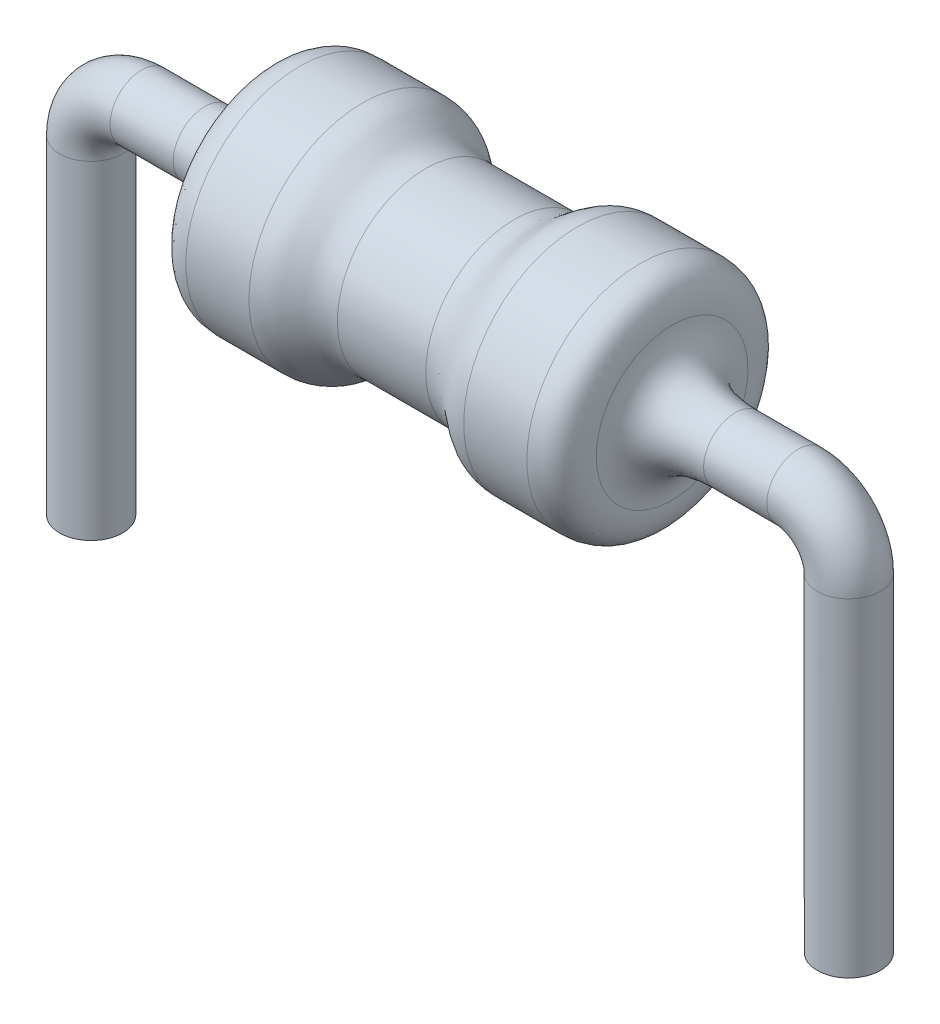
ISO-10303-21;
HEADER;
FILE_DESCRIPTION(('STEP AP214'),'2;1');
FILE_NAME('part.step','',(''),(''),'','','');
FILE_SCHEMA(('AUTOMOTIVE_DESIGN { 1 0 10303 214 1 1 1 1 }'));
ENDSEC;
DATA;
#1=APPLICATION_CONTEXT('core data for automotive mechanical design processes');
#2=APPLICATION_PROTOCOL_DEFINITION('international standard','automotive_design',2000,#1);
#3=PRODUCT_CONTEXT('',#1,'mechanical');
#4=PRODUCT('Part','Part','',(#3));
#5=PRODUCT_RELATED_PRODUCT_CATEGORY('part','',(#4));
#6=PRODUCT_DEFINITION_FORMATION('','',#4);
#7=PRODUCT_DEFINITION_CONTEXT('part definition',#1,'design');
#8=PRODUCT_DEFINITION('design','',#6,#7);
#9=PRODUCT_DEFINITION_SHAPE('','',#8);
#10=(LENGTH_UNIT() NAMED_UNIT(*) SI_UNIT(.MILLI.,.METRE.));
#11=(NAMED_UNIT(*) PLANE_ANGLE_UNIT() SI_UNIT($,.RADIAN.));
#12=(NAMED_UNIT(*) SI_UNIT($,.STERADIAN.) SOLID_ANGLE_UNIT());
#13=UNCERTAINTY_MEASURE_WITH_UNIT(LENGTH_MEASURE(1.E-05),#10,'distance_accuracy_value','');
#14=(GEOMETRIC_REPRESENTATION_CONTEXT(3) GLOBAL_UNCERTAINTY_ASSIGNED_CONTEXT((#13)) GLOBAL_UNIT_ASSIGNED_CONTEXT((#10,
#11,#12)) REPRESENTATION_CONTEXT('',''));
#15=CARTESIAN_POINT('',(0.,0.,0.));
#16=DIRECTION('',(0.,0.,1.));
#17=DIRECTION('',(1.,0.,0.));
#18=AXIS2_PLACEMENT_3D('',#15,#16,#17);
#19=CARTESIAN_POINT('',(-0.35,0.7,0.));
#20=CARTESIAN_POINT('',(-0.599999999996424,0.69999999999106,0.));
#21=CARTESIAN_POINT('',(-0.600000000003576,0.899999999988199,0.));
#22=CARTESIAN_POINT('',(-0.85,0.899999999979259,0.));
#23=B_SPLINE_CURVE_WITH_KNOTS('',3,(#19,#20,#21,#22),.UNSPECIFIED.,.F.,.F.,(4,4),(0.,1.),.UNSPECIFIED.);
#24=CARTESIAN_POINT('',(2.1,0.,0.));
#25=DIRECTION('',(1.,0.,0.));
#26=AXIS1_PLACEMENT('',#24,#25);
#27=SURFACE_OF_REVOLUTION('',#23,#26);
#28=CARTESIAN_POINT('',(-0.85,0.,0.));
#29=DIRECTION('',(1.,0.,0.));
#30=DIRECTION('',(0.,1.,0.));
#31=AXIS2_PLACEMENT_3D('',#28,#29,#30);
#32=CIRCLE('',#31,0.9);
#33=CARTESIAN_POINT('',(-0.85,0.9,0.));
#34=VERTEX_POINT('',#33);
#35=EDGE_CURVE('E10',#34,#34,#32,.T.);
#36=ORIENTED_EDGE('',*,*,#35,.T.);
#37=EDGE_LOOP('',(#36));
#38=FACE_BOUND('',#37,.T.);
#39=CARTESIAN_POINT('',(-0.35,0.,0.));
#40=DIRECTION('',(1.,0.,0.));
#41=DIRECTION('',(0.,1.,0.));
#42=AXIS2_PLACEMENT_3D('',#39,#40,#41);
#43=CIRCLE('',#42,0.7);
#44=CARTESIAN_POINT('',(-0.35,0.7,0.));
#45=VERTEX_POINT('',#44);
#46=EDGE_CURVE('E63',#45,#45,#43,.T.);
#47=ORIENTED_EDGE('',*,*,#46,.F.);
#48=EDGE_LOOP('',(#47));
#49=FACE_BOUND('',#48,.T.);
#50=ADVANCED_FACE('F31',(#38,#49),#27,.F.);
#51=CARTESIAN_POINT('',(2.1,0.,0.));
#52=DIRECTION('',(1.,0.,0.));
#53=DIRECTION('',(0.,1.,0.));
#54=AXIS2_PLACEMENT_3D('',#51,#52,#53);
#55=CYLINDRICAL_SURFACE('',#54,0.899999999984824);
#56=CARTESIAN_POINT('',(-1.3499999997216,0.,0.));
#57=DIRECTION('',(1.,0.,0.));
#58=DIRECTION('',(0.,1.,0.));
#59=AXIS2_PLACEMENT_3D('',#56,#57,#58);
#60=CIRCLE('',#59,0.899999999969648);
#61=CARTESIAN_POINT('',(-1.3499999997216,0.899999999969649,0.));
#62=VERTEX_POINT('',#61);
#63=EDGE_CURVE('E38',#62,#62,#60,.T.);
#64=ORIENTED_EDGE('',*,*,#63,.T.);
#65=EDGE_LOOP('',(#64));
#66=FACE_BOUND('',#65,.T.);
#67=ORIENTED_EDGE('',*,*,#35,.F.);
#68=EDGE_LOOP('',(#67));
#69=FACE_BOUND('',#68,.T.);
#70=ADVANCED_FACE('F126',(#66,#69),#55,.T.);
#71=CARTESIAN_POINT('',(641033.192331462,-767511.290208308,0.));
#72=CARTESIAN_POINT('',(-640564.073553952,767906.837244925,0.));
#73=CARTESIAN_POINT('',(640088.902784248,-768298.986280384,0.));
#74=B_SPLINE_CURVE_WITH_KNOTS('',2,(#71,#72,#73),.UNSPECIFIED.,.F.,.F.,(3,3),(0.,1.),.UNSPECIFIED.);
#75=CARTESIAN_POINT('',(2.1,0.,0.));
#76=DIRECTION('',(1.,0.,0.));
#77=AXIS1_PLACEMENT('',#75,#76);
#78=SURFACE_OF_REVOLUTION('',#74,#77);
#79=CARTESIAN_POINT('',(-1.5999999249387,0.,0.));
#80=DIRECTION('',(1.,0.,0.));
#81=DIRECTION('',(0.,1.,0.));
#82=AXIS2_PLACEMENT_3D('',#79,#80,#81);
#83=CIRCLE('',#82,0.600300023269828);
#84=CARTESIAN_POINT('',(-1.5999999249387,0.600300023269829,0.));
#85=VERTEX_POINT('',#84);
#86=EDGE_CURVE('E42',#85,#85,#83,.T.);
#87=ORIENTED_EDGE('',*,*,#86,.T.);
#88=EDGE_LOOP('',(#87));
#89=FACE_BOUND('',#88,.T.);
#90=ORIENTED_EDGE('',*,*,#63,.F.);
#91=EDGE_LOOP('',(#90));
#92=FACE_BOUND('',#91,.T.);
#93=ADVANCED_FACE('F124',(#89,#92),#78,.F.);
#94=CARTESIAN_POINT('',(-819043.574263596,573734.555233794,0.));
#95=CARTESIAN_POINT('',(819461.031277219,-573132.131263466,0.));
#96=CARTESIAN_POINT('',(-819885.104338312,572531.338791372,0.));
#97=B_SPLINE_CURVE_WITH_KNOTS('',2,(#94,#95,#96),.UNSPECIFIED.,.F.,.F.,(3,3),(0.,1.),.UNSPECIFIED.);
#98=CARTESIAN_POINT('',(2.1,0.,0.));
#99=DIRECTION('',(1.,0.,0.));
#100=AXIS1_PLACEMENT('',#98,#99);
#101=SURFACE_OF_REVOLUTION('',#97,#100);
#102=CARTESIAN_POINT('',(-2.1,0.,0.));
#103=DIRECTION('',(-1.,0.,0.));
#104=DIRECTION('',(0.,-1.,0.));
#105=AXIS2_PLACEMENT_3D('',#102,#103,#104);
#106=CIRCLE('',#105,0.25);
#107=CARTESIAN_POINT('',(-2.1,-0.25,0.));
#108=VERTEX_POINT('',#107);
#109=EDGE_CURVE('E163',#108,#108,#106,.F.);
#110=ORIENTED_EDGE('',*,*,#109,.T.);
#111=EDGE_LOOP('',(#110));
#112=FACE_BOUND('',#111,.T.);
#113=ORIENTED_EDGE('',*,*,#86,.F.);
#114=EDGE_LOOP('',(#113));
#115=FACE_BOUND('',#114,.T.);
#116=ADVANCED_FACE('F97',(#112,#115),#101,.F.);
#117=CARTESIAN_POINT('',(819885.104338312,572531.338791372,0.));
#118=CARTESIAN_POINT('',(-819461.031277219,-573132.131263466,0.));
#119=CARTESIAN_POINT('',(819043.574263596,573734.555233794,0.));
#120=B_SPLINE_CURVE_WITH_KNOTS('',2,(#117,#118,#119),.UNSPECIFIED.,.F.,.F.,(3,3),(0.,1.),.UNSPECIFIED.);
#121=CARTESIAN_POINT('',(2.1,0.,0.));
#122=DIRECTION('',(1.,0.,0.));
#123=AXIS1_PLACEMENT('',#121,#122);
#124=SURFACE_OF_REVOLUTION('',#120,#123);
#125=CARTESIAN_POINT('',(1.5999999250196,0.,0.));
#126=DIRECTION('',(1.,0.,0.));
#127=DIRECTION('',(0.,1.,0.));
#128=AXIS2_PLACEMENT_3D('',#125,#126,#127);
#129=CIRCLE('',#128,0.600300016563332);
#130=CARTESIAN_POINT('',(1.5999999250196,0.600300016563332,0.));
#131=VERTEX_POINT('',#130);
#132=EDGE_CURVE('E51',#131,#131,#129,.T.);
#133=ORIENTED_EDGE('',*,*,#132,.T.);
#134=EDGE_LOOP('',(#133));
#135=FACE_BOUND('',#134,.T.);
#136=CARTESIAN_POINT('',(2.1000000011081,0.,0.));
#137=DIRECTION('',(1.,0.,0.));
#138=DIRECTION('',(0.,1.,0.));
#139=AXIS2_PLACEMENT_3D('',#136,#137,#138);
#140=CIRCLE('',#139,0.250000000101532);
#141=CARTESIAN_POINT('',(2.1000000011081,0.250000000101532,0.));
#142=VERTEX_POINT('',#141);
#143=EDGE_CURVE('E46',#142,#142,#140,.T.);
#144=ORIENTED_EDGE('',*,*,#143,.F.);
#145=EDGE_LOOP('',(#144));
#146=FACE_BOUND('',#145,.T.);
#147=ADVANCED_FACE('F93',(#135,#146),#124,.F.);
#148=CARTESIAN_POINT('',(-640088.902784248,-768298.986280384,0.));
#149=CARTESIAN_POINT('',(640564.073553952,767906.837244925,0.));
#150=CARTESIAN_POINT('',(-641033.192331462,-767511.290208308,0.));
#151=B_SPLINE_CURVE_WITH_KNOTS('',2,(#148,#149,#150),.UNSPECIFIED.,.F.,.F.,(3,3),(0.,1.),.UNSPECIFIED.);
#152=CARTESIAN_POINT('',(2.1,0.,0.));
#153=DIRECTION('',(1.,0.,0.));
#154=AXIS1_PLACEMENT('',#152,#153);
#155=SURFACE_OF_REVOLUTION('',#151,#154);
#156=CARTESIAN_POINT('',(1.35,0.,0.));
#157=DIRECTION('',(1.,0.,0.));
#158=DIRECTION('',(0.,1.,0.));
#159=AXIS2_PLACEMENT_3D('',#156,#157,#158);
#160=CIRCLE('',#159,0.9);
#161=CARTESIAN_POINT('',(1.35,0.9,0.));
#162=VERTEX_POINT('',#161);
#163=EDGE_CURVE('E54',#162,#162,#160,.T.);
#164=ORIENTED_EDGE('',*,*,#163,.T.);
#165=EDGE_LOOP('',(#164));
#166=FACE_BOUND('',#165,.T.);
#167=ORIENTED_EDGE('',*,*,#132,.F.);
#168=EDGE_LOOP('',(#167));
#169=FACE_BOUND('',#168,.T.);
#170=ADVANCED_FACE('F89',(#166,#169),#155,.F.);
#171=CARTESIAN_POINT('',(2.1,0.,0.));
#172=DIRECTION('',(1.,0.,0.));
#173=DIRECTION('',(0.,1.,0.));
#174=AXIS2_PLACEMENT_3D('',#171,#172,#173);
#175=CYLINDRICAL_SURFACE('',#174,0.9);
#176=CARTESIAN_POINT('',(0.85,0.,0.));
#177=DIRECTION('',(1.,0.,0.));
#178=DIRECTION('',(0.,1.,0.));
#179=AXIS2_PLACEMENT_3D('',#176,#177,#178);
#180=CIRCLE('',#179,0.899999999999999);
#181=CARTESIAN_POINT('',(0.85,0.9,0.));
#182=VERTEX_POINT('',#181);
#183=EDGE_CURVE('E57',#182,#182,#180,.T.);
#184=ORIENTED_EDGE('',*,*,#183,.T.);
#185=EDGE_LOOP('',(#184));
#186=FACE_BOUND('',#185,.T.);
#187=ORIENTED_EDGE('',*,*,#163,.F.);
#188=EDGE_LOOP('',(#187));
#189=FACE_BOUND('',#188,.T.);
#190=ADVANCED_FACE('F84',(#186,#189),#175,.T.);
#191=CARTESIAN_POINT('',(0.85,0.9,0.));
#192=CARTESIAN_POINT('',(0.6,0.9,0.));
#193=CARTESIAN_POINT('',(0.6,0.7,0.));
#194=CARTESIAN_POINT('',(0.35,0.7,0.));
#195=B_SPLINE_CURVE_WITH_KNOTS('',3,(#191,#192,#193,#194),.UNSPECIFIED.,.F.,.F.,(4,4),(0.,1.),.UNSPECIFIED.);
#196=CARTESIAN_POINT('',(2.1,0.,0.));
#197=DIRECTION('',(1.,0.,0.));
#198=AXIS1_PLACEMENT('',#196,#197);
#199=SURFACE_OF_REVOLUTION('',#195,#198);
#200=CARTESIAN_POINT('',(0.35,0.,0.));
#201=DIRECTION('',(1.,0.,0.));
#202=DIRECTION('',(0.,1.,0.));
#203=AXIS2_PLACEMENT_3D('',#200,#201,#202);
#204=CIRCLE('',#203,0.7);
#205=CARTESIAN_POINT('',(0.35,0.7,0.));
#206=VERTEX_POINT('',#205);
#207=EDGE_CURVE('E60',#206,#206,#204,.T.);
#208=ORIENTED_EDGE('',*,*,#207,.T.);
#209=EDGE_LOOP('',(#208));
#210=FACE_BOUND('',#209,.T.);
#211=ORIENTED_EDGE('',*,*,#183,.F.);
#212=EDGE_LOOP('',(#211));
#213=FACE_BOUND('',#212,.T.);
#214=ADVANCED_FACE('F79',(#210,#213),#199,.F.);
#215=CARTESIAN_POINT('',(2.1,0.,0.));
#216=DIRECTION('',(1.,0.,0.));
#217=DIRECTION('',(0.,1.,0.));
#218=AXIS2_PLACEMENT_3D('',#215,#216,#217);
#219=CYLINDRICAL_SURFACE('',#218,0.7);
#220=ORIENTED_EDGE('',*,*,#46,.T.);
#221=EDGE_LOOP('',(#220));
#222=FACE_BOUND('',#221,.T.);
#223=ORIENTED_EDGE('',*,*,#207,.F.);
#224=EDGE_LOOP('',(#223));
#225=FACE_BOUND('',#224,.T.);
#226=ADVANCED_FACE('F83',(#222,#225),#219,.T.);
#227=CARTESIAN_POINT('',(2.6,0.,0.));
#228=DIRECTION('',(-1.,0.,0.));
#229=DIRECTION('',(0.,-1.,0.));
#230=AXIS2_PLACEMENT_3D('',#227,#228,#229);
#231=CYLINDRICAL_SURFACE('',#230,0.25);
#232=ORIENTED_EDGE('',*,*,#143,.T.);
#233=EDGE_LOOP('',(#232));
#234=FACE_BOUND('',#233,.T.);
#235=CARTESIAN_POINT('',(2.6,0.,0.));
#236=DIRECTION('',(-1.,0.,0.));
#237=DIRECTION('',(0.,0.,1.));
#238=AXIS2_PLACEMENT_3D('',#235,#236,#237);
#239=CIRCLE('',#238,0.25);
#240=CARTESIAN_POINT('',(2.6,0.250000000000001,0.));
#241=VERTEX_POINT('',#240);
#242=EDGE_CURVE('E66',#241,#241,#239,.T.);
#243=ORIENTED_EDGE('',*,*,#242,.T.);
#244=EDGE_LOOP('',(#243));
#245=FACE_BOUND('',#244,.T.);
#246=ADVANCED_FACE('F140',(#234,#245),#231,.T.);
#247=CARTESIAN_POINT('',(2.6,-0.4,0.));
#248=DIRECTION('',(0.,0.,1.));
#249=DIRECTION('',(1.,0.,0.));
#250=AXIS2_PLACEMENT_3D('',#247,#248,#249);
#251=TOROIDAL_SURFACE('',#250,0.4,0.25);
#252=CARTESIAN_POINT('',(3.,-0.4,0.));
#253=DIRECTION('',(0.,1.,0.));
#254=DIRECTION('',(0.,0.,1.));
#255=AXIS2_PLACEMENT_3D('',#252,#253,#254);
#256=CIRCLE('',#255,0.25);
#257=CARTESIAN_POINT('',(3.25,-0.4,0.));
#258=VERTEX_POINT('',#257);
#259=EDGE_CURVE('E157',#258,#258,#256,.T.);
#260=CARTESIAN_POINT('',(2.6,-0.4,0.));
#261=DIRECTION('',(0.,0.,1.));
#262=DIRECTION('',(1.,0.,0.));
#263=AXIS2_PLACEMENT_3D('',#260,#261,#262);
#264=CIRCLE('',#263,0.650000000000001);
#265=EDGE_CURVE('',#258,#241,#264,.T.);
#266=ORIENTED_EDGE('',*,*,#259,.T.);
#267=ORIENTED_EDGE('',*,*,#242,.F.);
#268=ORIENTED_EDGE('',*,*,#265,.T.);
#269=ORIENTED_EDGE('',*,*,#265,.F.);
#270=EDGE_LOOP('',(#266,#268,#267,#269));
#271=FACE_BOUND('',#270,.T.);
#272=ADVANCED_FACE('F153',(#271),#251,.T.);
#273=CARTESIAN_POINT('',(3.,-0.4,0.));
#274=DIRECTION('',(0.,-1.,0.));
#275=DIRECTION('',(1.,0.,0.));
#276=AXIS2_PLACEMENT_3D('',#273,#274,#275);
#277=CYLINDRICAL_SURFACE('',#276,0.25);
#278=ORIENTED_EDGE('',*,*,#259,.F.);
#279=EDGE_LOOP('',(#278));
#280=FACE_BOUND('',#279,.T.);
#281=CARTESIAN_POINT('',(3.,-3.,0.));
#282=DIRECTION('',(0.,1.,0.));
#283=DIRECTION('',(0.,0.,1.));
#284=AXIS2_PLACEMENT_3D('',#281,#282,#283);
#285=CIRCLE('',#284,0.25);
#286=CARTESIAN_POINT('',(3.,-3.,0.25));
#287=VERTEX_POINT('',#286);
#288=EDGE_CURVE('E159',#287,#287,#285,.T.);
#289=ORIENTED_EDGE('',*,*,#288,.T.);
#290=EDGE_LOOP('',(#289));
#291=FACE_BOUND('',#290,.T.);
#292=ADVANCED_FACE('F194',(#280,#291),#277,.T.);
#293=CARTESIAN_POINT('',(3.,-3.,0.));
#294=DIRECTION('',(0.,1.,0.));
#295=DIRECTION('',(0.,0.,1.));
#296=AXIS2_PLACEMENT_3D('',#293,#294,#295);
#297=PLANE('',#296);
#298=ORIENTED_EDGE('',*,*,#288,.F.);
#299=EDGE_LOOP('',(#298));
#300=FACE_BOUND('',#299,.T.);
#301=ADVANCED_FACE('F188',(#300),#297,.F.);
#302=CARTESIAN_POINT('',(-2.6,0.,0.));
#303=DIRECTION('',(1.,0.,0.));
#304=DIRECTION('',(0.,1.,0.));
#305=AXIS2_PLACEMENT_3D('',#302,#303,#304);
#306=CYLINDRICAL_SURFACE('',#305,0.25);
#307=ORIENTED_EDGE('',*,*,#109,.F.);
#308=EDGE_LOOP('',(#307));
#309=FACE_BOUND('',#308,.T.);
#310=CARTESIAN_POINT('',(-2.6,0.,0.));
#311=DIRECTION('',(-1.,0.,0.));
#312=DIRECTION('',(0.,0.,1.));
#313=AXIS2_PLACEMENT_3D('',#310,#311,#312);
#314=CIRCLE('',#313,0.25);
#315=CARTESIAN_POINT('',(-2.6,0.250000000000001,0.));
#316=VERTEX_POINT('',#315);
#317=EDGE_CURVE('E167',#316,#316,#314,.T.);
#318=ORIENTED_EDGE('',*,*,#317,.F.);
#319=EDGE_LOOP('',(#318));
#320=FACE_BOUND('',#319,.T.);
#321=ADVANCED_FACE('F183',(#309,#320),#306,.T.);
#322=CARTESIAN_POINT('',(-2.6,-0.4,0.));
#323=DIRECTION('',(0.,0.,-1.));
#324=DIRECTION('',(-1.,0.,0.));
#325=AXIS2_PLACEMENT_3D('',#322,#323,#324);
#326=TOROIDAL_SURFACE('',#325,0.4,0.25);
#327=CARTESIAN_POINT('',(-3.,-0.4,0.));
#328=DIRECTION('',(0.,-1.,0.));
#329=DIRECTION('',(0.,0.,1.));
#330=AXIS2_PLACEMENT_3D('',#327,#328,#329);
#331=CIRCLE('',#330,0.25);
#332=CARTESIAN_POINT('',(-3.25,-0.4,0.));
#333=VERTEX_POINT('',#332);
#334=EDGE_CURVE('E170',#333,#333,#331,.T.);
#335=CARTESIAN_POINT('',(-2.6,-0.4,0.));
#336=DIRECTION('',(0.,0.,-1.));
#337=DIRECTION('',(-1.,0.,0.));
#338=AXIS2_PLACEMENT_3D('',#335,#336,#337);
#339=CIRCLE('',#338,0.650000000000001);
#340=EDGE_CURVE('',#333,#316,#339,.T.);
#341=ORIENTED_EDGE('',*,*,#334,.F.);
#342=ORIENTED_EDGE('',*,*,#317,.T.);
#343=ORIENTED_EDGE('',*,*,#340,.T.);
#344=ORIENTED_EDGE('',*,*,#340,.F.);
#345=EDGE_LOOP('',(#341,#343,#342,#344));
#346=FACE_BOUND('',#345,.T.);
#347=ADVANCED_FACE('F180',(#346),#326,.T.);
#348=CARTESIAN_POINT('',(-3.,-0.4,0.));
#349=DIRECTION('',(0.,-1.,0.));
#350=DIRECTION('',(1.,0.,0.));
#351=AXIS2_PLACEMENT_3D('',#348,#349,#350);
#352=CYLINDRICAL_SURFACE('',#351,0.25);
#353=ORIENTED_EDGE('',*,*,#334,.T.);
#354=EDGE_LOOP('',(#353));
#355=FACE_BOUND('',#354,.T.);
#356=CARTESIAN_POINT('',(-3.,-3.,0.));
#357=DIRECTION('',(0.,-1.,0.));
#358=DIRECTION('',(0.,0.,1.));
#359=AXIS2_PLACEMENT_3D('',#356,#357,#358);
#360=CIRCLE('',#359,0.25);
#361=CARTESIAN_POINT('',(-3.,-3.,0.25));
#362=VERTEX_POINT('',#361);
#363=EDGE_CURVE('E171',#362,#362,#360,.T.);
#364=ORIENTED_EDGE('',*,*,#363,.F.);
#365=EDGE_LOOP('',(#364));
#366=FACE_BOUND('',#365,.T.);
#367=ADVANCED_FACE('F177',(#355,#366),#352,.T.);
#368=CARTESIAN_POINT('',(-3.,-3.,0.));
#369=DIRECTION('',(0.,1.,0.));
#370=DIRECTION('',(0.,0.,1.));
#371=AXIS2_PLACEMENT_3D('',#368,#369,#370);
#372=PLANE('',#371);
#373=ORIENTED_EDGE('',*,*,#363,.T.);
#374=EDGE_LOOP('',(#373));
#375=FACE_BOUND('',#374,.T.);
#376=ADVANCED_FACE('F239',(#375),#372,.F.);
#377=CLOSED_SHELL('',(#50,#70,#93,#116,#147,#170,#190,#214,#226,#246,#272,#292,#301,#321,#347,
#367,#376));
#378=MANIFOLD_SOLID_BREP('B2',#377);
#379=ADVANCED_BREP_SHAPE_REPRESENTATION('',(#18,#378),#14);
#380=SHAPE_DEFINITION_REPRESENTATION(#9,#379);
ENDSEC;
END-ISO-10303-21;
